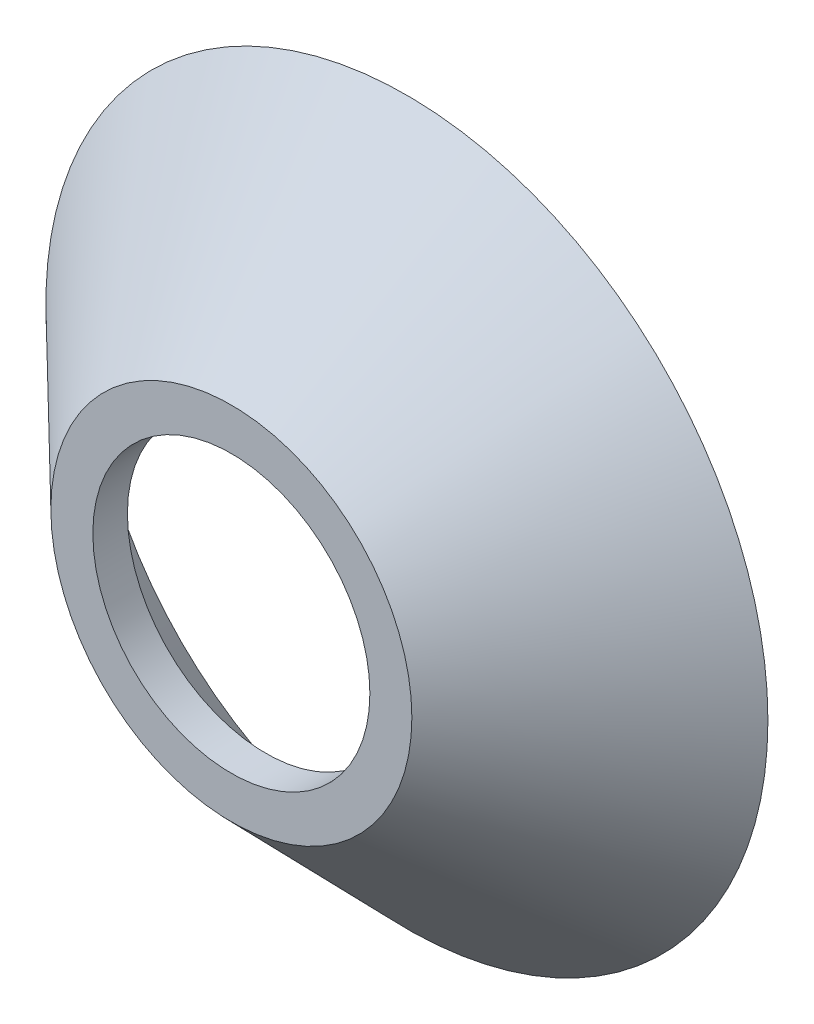
ISO-10303-21;
HEADER;
FILE_DESCRIPTION(('STEP AP214'),'2;1');
FILE_NAME('part.step','',(''),(''),'','','');
FILE_SCHEMA(('AUTOMOTIVE_DESIGN { 1 0 10303 214 1 1 1 1 }'));
ENDSEC;
DATA;
#1=APPLICATION_CONTEXT('core data for automotive mechanical design processes');
#2=APPLICATION_PROTOCOL_DEFINITION('international standard','automotive_design',2000,#1);
#3=PRODUCT_CONTEXT('',#1,'mechanical');
#4=PRODUCT('Part','Part','',(#3));
#5=PRODUCT_RELATED_PRODUCT_CATEGORY('part','',(#4));
#6=PRODUCT_DEFINITION_FORMATION('','',#4);
#7=PRODUCT_DEFINITION_CONTEXT('part definition',#1,'design');
#8=PRODUCT_DEFINITION('design','',#6,#7);
#9=PRODUCT_DEFINITION_SHAPE('','',#8);
#10=(LENGTH_UNIT() NAMED_UNIT(*) SI_UNIT(.MILLI.,.METRE.));
#11=(NAMED_UNIT(*) PLANE_ANGLE_UNIT() SI_UNIT($,.RADIAN.));
#12=(NAMED_UNIT(*) SI_UNIT($,.STERADIAN.) SOLID_ANGLE_UNIT());
#13=UNCERTAINTY_MEASURE_WITH_UNIT(LENGTH_MEASURE(1.E-05),#10,'distance_accuracy_value','');
#14=(GEOMETRIC_REPRESENTATION_CONTEXT(3) GLOBAL_UNCERTAINTY_ASSIGNED_CONTEXT((#13)) GLOBAL_UNIT_ASSIGNED_CONTEXT((#10,
#11,#12)) REPRESENTATION_CONTEXT('',''));
#15=CARTESIAN_POINT('',(0.,0.,0.));
#16=DIRECTION('',(0.,0.,1.));
#17=DIRECTION('',(1.,0.,0.));
#18=AXIS2_PLACEMENT_3D('',#15,#16,#17);
#19=CARTESIAN_POINT('',(0.,0.,0.));
#20=DIRECTION('',(0.,0.,-1.));
#21=DIRECTION('',(-1.,0.,0.));
#22=AXIS2_PLACEMENT_3D('',#19,#20,#21);
#23=PLANE('',#22);
#24=CARTESIAN_POINT('',(0.,0.,0.));
#25=DIRECTION('',(0.,0.,1.));
#26=DIRECTION('',(1.,0.,0.));
#27=AXIS2_PLACEMENT_3D('',#24,#25,#26);
#28=CIRCLE('',#27,19.4921583775072);
#29=CARTESIAN_POINT('',(19.4921583775072,0.,0.));
#30=VERTEX_POINT('',#29);
#31=EDGE_CURVE('E59',#30,#30,#28,.T.);
#32=ORIENTED_EDGE('',*,*,#31,.F.);
#33=EDGE_LOOP('',(#32));
#34=FACE_BOUND('',#33,.T.);
#35=CARTESIAN_POINT('',(0.,0.,0.));
#36=DIRECTION('',(0.,0.,1.));
#37=DIRECTION('',(1.,0.,0.));
#38=AXIS2_PLACEMENT_3D('',#35,#36,#37);
#39=CIRCLE('',#38,25.4);
#40=CARTESIAN_POINT('',(25.4,0.,0.));
#41=VERTEX_POINT('',#40);
#42=EDGE_CURVE('E10',#41,#41,#39,.T.);
#43=ORIENTED_EDGE('',*,*,#42,.T.);
#44=EDGE_LOOP('',(#43));
#45=FACE_BOUND('',#44,.T.);
#46=ADVANCED_FACE('F37',(#34,#45),#23,.F.);
#47=CARTESIAN_POINT('',(0.,0.,-24.7000527096891));
#48=DIRECTION('',(0.,0.,-1.));
#49=DIRECTION('',(-1.,0.,0.));
#50=AXIS2_PLACEMENT_3D('',#47,#48,#49);
#51=CONICAL_SURFACE('',#50,50.8,0.799368243611472);
#52=ORIENTED_EDGE('',*,*,#42,.F.);
#53=EDGE_LOOP('',(#52));
#54=FACE_BOUND('',#53,.T.);
#55=CARTESIAN_POINT('',(0.,0.,-24.7000527096891));
#56=DIRECTION('',(0.,0.,1.));
#57=DIRECTION('',(1.,0.,0.));
#58=AXIS2_PLACEMENT_3D('',#55,#56,#57);
#59=CIRCLE('',#58,50.8);
#60=CARTESIAN_POINT('',(50.8,0.,-24.7000527096891));
#61=VERTEX_POINT('',#60);
#62=EDGE_CURVE('E43',#61,#61,#59,.T.);
#63=ORIENTED_EDGE('',*,*,#62,.T.);
#64=EDGE_LOOP('',(#63));
#65=FACE_BOUND('',#64,.T.);
#66=ADVANCED_FACE('F67',(#54,#65),#51,.T.);
#67=CARTESIAN_POINT('',(-50.8,0.,-24.7000527096891));
#68=DIRECTION('',(0.,0.,1.));
#69=DIRECTION('',(1.,0.,0.));
#70=AXIS2_PLACEMENT_3D('',#67,#68,#69);
#71=PLANE('',#70);
#72=ORIENTED_EDGE('',*,*,#62,.F.);
#73=EDGE_LOOP('',(#72));
#74=FACE_BOUND('',#73,.T.);
#75=CARTESIAN_POINT('',(0.,0.,-24.7000527096891));
#76=DIRECTION('',(0.,0.,1.));
#77=DIRECTION('',(1.,0.,0.));
#78=AXIS2_PLACEMENT_3D('',#75,#76,#77);
#79=CIRCLE('',#78,44.8578609578703);
#80=CARTESIAN_POINT('',(44.8578609578703,0.,-24.7000527096891));
#81=VERTEX_POINT('',#80);
#82=EDGE_CURVE('E47',#81,#81,#79,.T.);
#83=ORIENTED_EDGE('',*,*,#82,.T.);
#84=EDGE_LOOP('',(#83));
#85=FACE_BOUND('',#84,.T.);
#86=ADVANCED_FACE('F73',(#74,#85),#71,.F.);
#87=CARTESIAN_POINT('',(0.,0.,-4.86567687742892));
#88=DIRECTION('',(0.,0.,-1.));
#89=DIRECTION('',(-1.,0.,0.));
#90=AXIS2_PLACEMENT_3D('',#87,#88,#89);
#91=CONICAL_SURFACE('',#90,24.4614208344131,0.799368243611473);
#92=ORIENTED_EDGE('',*,*,#82,.F.);
#93=EDGE_LOOP('',(#92));
#94=FACE_BOUND('',#93,.T.);
#95=CARTESIAN_POINT('',(0.,0.,-4.86567687742892));
#96=DIRECTION('',(0.,0.,1.));
#97=DIRECTION('',(1.,0.,0.));
#98=AXIS2_PLACEMENT_3D('',#95,#96,#97);
#99=CIRCLE('',#98,24.4614208344131);
#100=CARTESIAN_POINT('',(24.4614208344131,0.,-4.86567687742892));
#101=VERTEX_POINT('',#100);
#102=EDGE_CURVE('E51',#101,#101,#99,.T.);
#103=ORIENTED_EDGE('',*,*,#102,.T.);
#104=EDGE_LOOP('',(#103));
#105=FACE_BOUND('',#104,.T.);
#106=ADVANCED_FACE('F78',(#94,#105),#91,.F.);
#107=CARTESIAN_POINT('',(-24.4614208344131,0.,-4.86567687742892));
#108=DIRECTION('',(0.,0.,1.));
#109=DIRECTION('',(1.,0.,0.));
#110=AXIS2_PLACEMENT_3D('',#107,#108,#109);
#111=PLANE('',#110);
#112=CARTESIAN_POINT('',(0.,0.,-4.86567687742892));
#113=DIRECTION('',(0.,0.,1.));
#114=DIRECTION('',(1.,0.,0.));
#115=AXIS2_PLACEMENT_3D('',#112,#113,#114);
#116=CIRCLE('',#115,19.4921583775072);
#117=CARTESIAN_POINT('',(19.4921583775072,0.,-4.86567687742892));
#118=VERTEX_POINT('',#117);
#119=EDGE_CURVE('E56',#118,#118,#116,.F.);
#120=ORIENTED_EDGE('',*,*,#119,.F.);
#121=EDGE_LOOP('',(#120));
#122=FACE_BOUND('',#121,.T.);
#123=ORIENTED_EDGE('',*,*,#102,.F.);
#124=EDGE_LOOP('',(#123));
#125=FACE_BOUND('',#124,.T.);
#126=ADVANCED_FACE('F83',(#122,#125),#111,.F.);
#127=CARTESIAN_POINT('',(0.,0.,-24.7010527096891));
#128=DIRECTION('',(0.,0.,1.));
#129=DIRECTION('',(1.,0.,0.));
#130=AXIS2_PLACEMENT_3D('',#127,#128,#129);
#131=CYLINDRICAL_SURFACE('',#130,19.4921583775072);
#132=ORIENTED_EDGE('',*,*,#31,.T.);
#133=EDGE_LOOP('',(#132));
#134=FACE_BOUND('',#133,.T.);
#135=ORIENTED_EDGE('',*,*,#119,.T.);
#136=EDGE_LOOP('',(#135));
#137=FACE_BOUND('',#136,.T.);
#138=ADVANCED_FACE('F63',(#134,#137),#131,.F.);
#139=CLOSED_SHELL('',(#46,#66,#86,#106,#126,#138));
#140=MANIFOLD_SOLID_BREP('B2',#139);
#141=ADVANCED_BREP_SHAPE_REPRESENTATION('',(#18,#140),#14);
#142=SHAPE_DEFINITION_REPRESENTATION(#9,#141);
ENDSEC;
END-ISO-10303-21;
